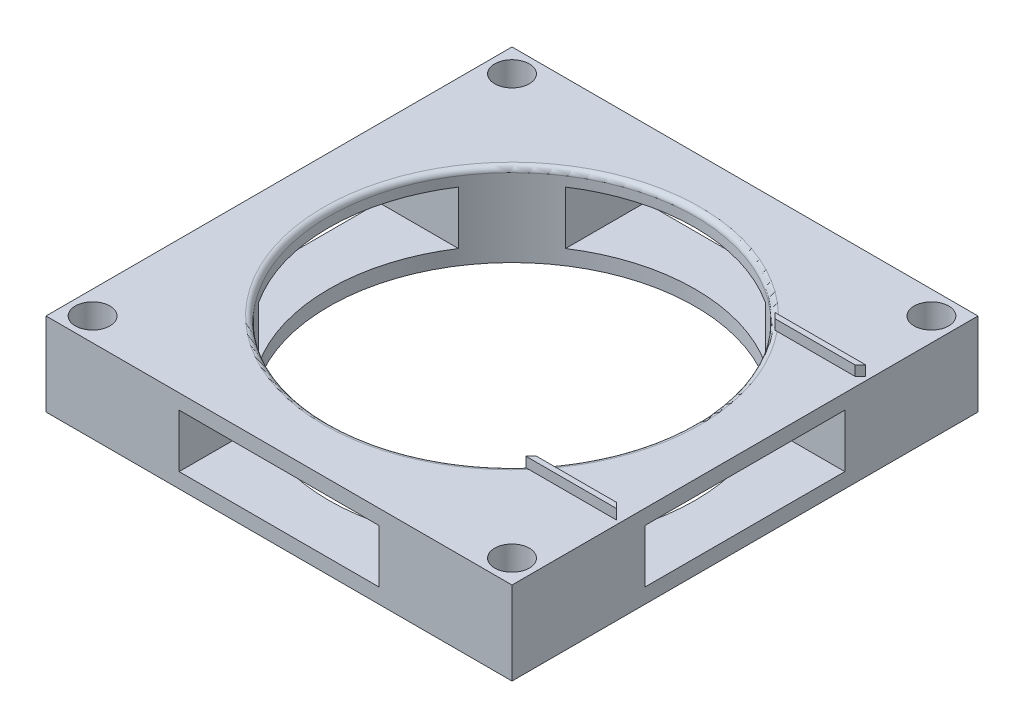
ISO-10303-21;
HEADER;
FILE_DESCRIPTION(('STEP AP214'),'2;1');
FILE_NAME('part.step','',(''),(''),'','','');
FILE_SCHEMA(('AUTOMOTIVE_DESIGN { 1 0 10303 214 1 1 1 1 }'));
ENDSEC;
DATA;
#1=APPLICATION_CONTEXT('core data for automotive mechanical design processes');
#2=APPLICATION_PROTOCOL_DEFINITION('international standard','automotive_design',2000,#1);
#3=PRODUCT_CONTEXT('',#1,'mechanical');
#4=PRODUCT('Part','Part','',(#3));
#5=PRODUCT_RELATED_PRODUCT_CATEGORY('part','',(#4));
#6=PRODUCT_DEFINITION_FORMATION('','',#4);
#7=PRODUCT_DEFINITION_CONTEXT('part definition',#1,'design');
#8=PRODUCT_DEFINITION('design','',#6,#7);
#9=PRODUCT_DEFINITION_SHAPE('','',#8);
#10=(LENGTH_UNIT() NAMED_UNIT(*) SI_UNIT(.MILLI.,.METRE.));
#11=(NAMED_UNIT(*) PLANE_ANGLE_UNIT() SI_UNIT($,.RADIAN.));
#12=(NAMED_UNIT(*) SI_UNIT($,.STERADIAN.) SOLID_ANGLE_UNIT());
#13=UNCERTAINTY_MEASURE_WITH_UNIT(LENGTH_MEASURE(1.E-05),#10,'distance_accuracy_value','');
#14=(GEOMETRIC_REPRESENTATION_CONTEXT(3) GLOBAL_UNCERTAINTY_ASSIGNED_CONTEXT((#13)) GLOBAL_UNIT_ASSIGNED_CONTEXT((#10,
#11,#12)) REPRESENTATION_CONTEXT('',''));
#15=CARTESIAN_POINT('',(0.,0.,0.));
#16=DIRECTION('',(0.,0.,1.));
#17=DIRECTION('',(1.,0.,0.));
#18=AXIS2_PLACEMENT_3D('',#15,#16,#17);
#19=CARTESIAN_POINT('',(0.,12.5,0.));
#20=DIRECTION('',(0.,1.,0.));
#21=DIRECTION('',(0.,0.,1.));
#22=AXIS2_PLACEMENT_3D('',#19,#20,#21);
#23=PLANE('',#22);
#24=CARTESIAN_POINT('',(31.5,12.5,-31.5));
#25=DIRECTION('',(0.,1.,0.));
#26=DIRECTION('',(0.,0.,1.));
#27=AXIS2_PLACEMENT_3D('',#24,#25,#26);
#28=CIRCLE('',#27,2.6);
#29=CARTESIAN_POINT('',(31.5,12.5,-28.9));
#30=VERTEX_POINT('',#29);
#31=EDGE_CURVE('E448',#30,#30,#28,.F.);
#32=ORIENTED_EDGE('',*,*,#31,.T.);
#33=EDGE_LOOP('',(#32));
#34=FACE_BOUND('',#33,.T.);
#35=CARTESIAN_POINT('',(-31.5,12.5,-31.5));
#36=DIRECTION('',(0.,1.,0.));
#37=DIRECTION('',(0.,0.,1.));
#38=AXIS2_PLACEMENT_3D('',#35,#36,#37);
#39=CIRCLE('',#38,2.6);
#40=CARTESIAN_POINT('',(-31.5,12.5,-28.9));
#41=VERTEX_POINT('',#40);
#42=EDGE_CURVE('E452',#41,#41,#39,.T.);
#43=ORIENTED_EDGE('',*,*,#42,.F.);
#44=EDGE_LOOP('',(#43));
#45=FACE_BOUND('',#44,.T.);
#46=DIRECTION('',(-1.,0.,0.));
#47=VECTOR('',#46,1.);
#48=CARTESIAN_POINT('',(0.,12.5,-35.));
#49=LINE('',#48,#47);
#50=CARTESIAN_POINT('',(35.,12.5,-35.));
#51=VERTEX_POINT('',#50);
#52=CARTESIAN_POINT('',(-35.,12.5,-35.));
#53=VERTEX_POINT('',#52);
#54=EDGE_CURVE('E457',#51,#53,#49,.T.);
#55=ORIENTED_EDGE('',*,*,#54,.T.);
#56=DIRECTION('',(0.,0.,1.));
#57=VECTOR('',#56,1.);
#58=CARTESIAN_POINT('',(-35.,12.5,0.));
#59=LINE('',#58,#57);
#60=CARTESIAN_POINT('',(-35.,12.5,35.));
#61=VERTEX_POINT('',#60);
#62=EDGE_CURVE('E461',#53,#61,#59,.T.);
#63=ORIENTED_EDGE('',*,*,#62,.T.);
#64=DIRECTION('',(-1.,0.,0.));
#65=VECTOR('',#64,1.);
#66=CARTESIAN_POINT('',(0.,12.5,35.));
#67=LINE('',#66,#65);
#68=CARTESIAN_POINT('',(35.,12.5,35.));
#69=VERTEX_POINT('',#68);
#70=EDGE_CURVE('E464',#69,#61,#67,.T.);
#71=ORIENTED_EDGE('',*,*,#70,.F.);
#72=DIRECTION('',(0.,0.,1.));
#73=VECTOR('',#72,1.);
#74=CARTESIAN_POINT('',(35.,12.5,0.));
#75=LINE('',#74,#73);
#76=EDGE_CURVE('E468',#51,#69,#75,.T.);
#77=ORIENTED_EDGE('',*,*,#76,.F.);
#78=EDGE_LOOP('',(#55,#63,#71,#77));
#79=FACE_BOUND('',#78,.T.);
#80=CARTESIAN_POINT('',(31.5,12.5,31.5));
#81=DIRECTION('',(0.,1.,0.));
#82=DIRECTION('',(0.,0.,1.));
#83=AXIS2_PLACEMENT_3D('',#80,#81,#82);
#84=CIRCLE('',#83,2.6);
#85=CARTESIAN_POINT('',(31.5,12.5,34.1));
#86=VERTEX_POINT('',#85);
#87=EDGE_CURVE('E472',#86,#86,#84,.T.);
#88=ORIENTED_EDGE('',*,*,#87,.F.);
#89=EDGE_LOOP('',(#88));
#90=FACE_BOUND('',#89,.T.);
#91=CARTESIAN_POINT('',(-31.5,12.5,31.5));
#92=DIRECTION('',(0.,1.,0.));
#93=DIRECTION('',(0.,0.,1.));
#94=AXIS2_PLACEMENT_3D('',#91,#92,#93);
#95=CIRCLE('',#94,2.6);
#96=CARTESIAN_POINT('',(-31.5,12.5,34.1));
#97=VERTEX_POINT('',#96);
#98=EDGE_CURVE('E476',#97,#97,#95,.F.);
#99=ORIENTED_EDGE('',*,*,#98,.T.);
#100=EDGE_LOOP('',(#99));
#101=FACE_BOUND('',#100,.T.);
#102=DIRECTION('',(-0.707106781186551,0.,-0.707106781186544));
#103=VECTOR('',#102,1.);
#104=CARTESIAN_POINT('',(33.6,12.5,17.9));
#105=LINE('',#104,#103);
#106=CARTESIAN_POINT('',(34.4,12.5,18.7));
#107=VERTEX_POINT('',#106);
#108=CARTESIAN_POINT('',(33.6,12.5,17.9));
#109=VERTEX_POINT('',#108);
#110=EDGE_CURVE('E374',#107,#109,#105,.T.);
#111=ORIENTED_EDGE('',*,*,#110,.F.);
#112=DIRECTION('',(1.,0.,0.));
#113=VECTOR('',#112,1.);
#114=CARTESIAN_POINT('',(34.4,12.5,18.7));
#115=LINE('',#114,#113);
#116=CARTESIAN_POINT('',(21.2414688757628,12.5,18.7));
#117=VERTEX_POINT('',#116);
#118=EDGE_CURVE('E379',#117,#107,#115,.T.);
#119=ORIENTED_EDGE('',*,*,#118,.F.);
#120=CARTESIAN_POINT('',(0.,12.5,0.));
#121=DIRECTION('',(0.,1.,0.));
#122=DIRECTION('',(0.,0.,1.));
#123=AXIS2_PLACEMENT_3D('',#120,#121,#122);
#124=CIRCLE('',#123,28.3);
#125=CARTESIAN_POINT('',(21.2414688757628,12.5,-18.7));
#126=VERTEX_POINT('',#125);
#127=EDGE_CURVE('E531',#117,#126,#124,.F.);
#128=ORIENTED_EDGE('',*,*,#127,.T.);
#129=DIRECTION('',(-1.,0.,0.));
#130=VECTOR('',#129,1.);
#131=CARTESIAN_POINT('',(34.4,12.5,-18.7));
#132=LINE('',#131,#130);
#133=CARTESIAN_POINT('',(34.4,12.5,-18.7));
#134=VERTEX_POINT('',#133);
#135=EDGE_CURVE('E406',#134,#126,#132,.T.);
#136=ORIENTED_EDGE('',*,*,#135,.F.);
#137=DIRECTION('',(0.707106781186549,0.,-0.707106781186546));
#138=VECTOR('',#137,1.);
#139=CARTESIAN_POINT('',(34.4,12.5,-18.7));
#140=LINE('',#139,#138);
#141=CARTESIAN_POINT('',(33.6,12.5,-17.9));
#142=VERTEX_POINT('',#141);
#143=EDGE_CURVE('E424',#142,#134,#140,.T.);
#144=ORIENTED_EDGE('',*,*,#143,.F.);
#145=DIRECTION('',(1.,0.,0.));
#146=VECTOR('',#145,1.);
#147=CARTESIAN_POINT('',(33.6,12.5,-17.9));
#148=LINE('',#147,#146);
#149=CARTESIAN_POINT('',(21.9198540141124,12.5,-17.9));
#150=VERTEX_POINT('',#149);
#151=EDGE_CURVE('E419',#150,#142,#148,.T.);
#152=ORIENTED_EDGE('',*,*,#151,.F.);
#153=CARTESIAN_POINT('',(21.9198540141124,12.5,17.9));
#154=VERTEX_POINT('',#153);
#155=EDGE_CURVE('E537',#150,#154,#124,.F.);
#156=ORIENTED_EDGE('',*,*,#155,.T.);
#157=DIRECTION('',(-1.,0.,0.));
#158=VECTOR('',#157,1.);
#159=CARTESIAN_POINT('',(33.6,12.5,17.9));
#160=LINE('',#159,#158);
#161=EDGE_CURVE('E370',#109,#154,#160,.T.);
#162=ORIENTED_EDGE('',*,*,#161,.F.);
#163=EDGE_LOOP('',(#111,#119,#128,#136,#144,#152,#156,#162));
#164=FACE_BOUND('',#163,.T.);
#165=ADVANCED_FACE('F47',(#34,#45,#79,#90,#101,#164),#23,.T.);
#166=CARTESIAN_POINT('',(0.,12.5,-35.));
#167=DIRECTION('',(0.,0.,1.));
#168=DIRECTION('',(1.,0.,0.));
#169=AXIS2_PLACEMENT_3D('',#166,#167,#168);
#170=PLANE('',#169);
#171=DIRECTION('',(-1.,0.,0.));
#172=VECTOR('',#171,1.);
#173=CARTESIAN_POINT('',(15.,10.25,-35.));
#174=LINE('',#173,#172);
#175=CARTESIAN_POINT('',(15.,10.25,-35.));
#176=VERTEX_POINT('',#175);
#177=CARTESIAN_POINT('',(-15.,10.25,-35.));
#178=VERTEX_POINT('',#177);
#179=EDGE_CURVE('E317',#176,#178,#174,.T.);
#180=ORIENTED_EDGE('',*,*,#179,.T.);
#181=DIRECTION('',(0.,-1.,0.));
#182=VECTOR('',#181,1.);
#183=CARTESIAN_POINT('',(-15.,2.25,-35.));
#184=LINE('',#183,#182);
#185=CARTESIAN_POINT('',(-15.,2.25,-35.));
#186=VERTEX_POINT('',#185);
#187=EDGE_CURVE('E304',#178,#186,#184,.T.);
#188=ORIENTED_EDGE('',*,*,#187,.T.);
#189=DIRECTION('',(1.,0.,0.));
#190=VECTOR('',#189,1.);
#191=CARTESIAN_POINT('',(15.,2.25,-35.));
#192=LINE('',#191,#190);
#193=CARTESIAN_POINT('',(15.,2.25,-35.));
#194=VERTEX_POINT('',#193);
#195=EDGE_CURVE('E308',#186,#194,#192,.T.);
#196=ORIENTED_EDGE('',*,*,#195,.T.);
#197=DIRECTION('',(0.,1.,0.));
#198=VECTOR('',#197,1.);
#199=CARTESIAN_POINT('',(15.,2.25,-35.));
#200=LINE('',#199,#198);
#201=EDGE_CURVE('E313',#194,#176,#200,.T.);
#202=ORIENTED_EDGE('',*,*,#201,.T.);
#203=EDGE_LOOP('',(#180,#188,#196,#202));
#204=FACE_BOUND('',#203,.T.);
#205=DIRECTION('',(-1.,0.,0.));
#206=VECTOR('',#205,1.);
#207=CARTESIAN_POINT('',(0.,0.,-35.));
#208=LINE('',#207,#206);
#209=CARTESIAN_POINT('',(35.,0.,-35.));
#210=VERTEX_POINT('',#209);
#211=CARTESIAN_POINT('',(-35.,0.,-35.));
#212=VERTEX_POINT('',#211);
#213=EDGE_CURVE('E489',#210,#212,#208,.T.);
#214=ORIENTED_EDGE('',*,*,#213,.T.);
#215=DIRECTION('',(0.,-1.,0.));
#216=VECTOR('',#215,1.);
#217=CARTESIAN_POINT('',(-35.,12.5,-35.));
#218=LINE('',#217,#216);
#219=EDGE_CURVE('E520',#53,#212,#218,.T.);
#220=ORIENTED_EDGE('',*,*,#219,.F.);
#221=ORIENTED_EDGE('',*,*,#54,.F.);
#222=DIRECTION('',(0.,-1.,0.));
#223=VECTOR('',#222,1.);
#224=CARTESIAN_POINT('',(35.,12.5,-35.));
#225=LINE('',#224,#223);
#226=EDGE_CURVE('E480',#51,#210,#225,.T.);
#227=ORIENTED_EDGE('',*,*,#226,.T.);
#228=EDGE_LOOP('',(#214,#220,#221,#227));
#229=FACE_BOUND('',#228,.T.);
#230=ADVANCED_FACE('F605',(#204,#229),#170,.F.);
#231=CARTESIAN_POINT('',(-35.,12.5,0.));
#232=DIRECTION('',(1.,0.,0.));
#233=DIRECTION('',(0.,0.,-1.));
#234=AXIS2_PLACEMENT_3D('',#231,#232,#233);
#235=PLANE('',#234);
#236=DIRECTION('',(0.,0.,1.));
#237=VECTOR('',#236,1.);
#238=CARTESIAN_POINT('',(-35.,10.25,-15.));
#239=LINE('',#238,#237);
#240=CARTESIAN_POINT('',(-35.,10.25,-15.));
#241=VERTEX_POINT('',#240);
#242=CARTESIAN_POINT('',(-35.,10.25,15.));
#243=VERTEX_POINT('',#242);
#244=EDGE_CURVE('E270',#241,#243,#239,.T.);
#245=ORIENTED_EDGE('',*,*,#244,.T.);
#246=DIRECTION('',(0.,-1.,0.));
#247=VECTOR('',#246,1.);
#248=CARTESIAN_POINT('',(-35.,10.25,15.));
#249=LINE('',#248,#247);
#250=CARTESIAN_POINT('',(-35.,2.25,15.));
#251=VERTEX_POINT('',#250);
#252=EDGE_CURVE('E252',#243,#251,#249,.T.);
#253=ORIENTED_EDGE('',*,*,#252,.T.);
#254=DIRECTION('',(0.,0.,-1.));
#255=VECTOR('',#254,1.);
#256=CARTESIAN_POINT('',(-35.,2.25000000000001,-15.));
#257=LINE('',#256,#255);
#258=CARTESIAN_POINT('',(-35.,2.25000000000001,-15.));
#259=VERTEX_POINT('',#258);
#260=EDGE_CURVE('E261',#251,#259,#257,.T.);
#261=ORIENTED_EDGE('',*,*,#260,.T.);
#262=DIRECTION('',(0.,1.,0.));
#263=VECTOR('',#262,1.);
#264=CARTESIAN_POINT('',(-35.,10.25,-15.));
#265=LINE('',#264,#263);
#266=EDGE_CURVE('E63',#259,#241,#265,.T.);
#267=ORIENTED_EDGE('',*,*,#266,.T.);
#268=EDGE_LOOP('',(#245,#253,#261,#267));
#269=FACE_BOUND('',#268,.T.);
#270=DIRECTION('',(0.,0.,1.));
#271=VECTOR('',#270,1.);
#272=CARTESIAN_POINT('',(-35.,0.,0.));
#273=LINE('',#272,#271);
#274=CARTESIAN_POINT('',(-35.,0.,35.));
#275=VERTEX_POINT('',#274);
#276=EDGE_CURVE('E493',#212,#275,#273,.T.);
#277=ORIENTED_EDGE('',*,*,#276,.T.);
#278=DIRECTION('',(0.,-1.,0.));
#279=VECTOR('',#278,1.);
#280=CARTESIAN_POINT('',(-35.,12.5,35.));
#281=LINE('',#280,#279);
#282=EDGE_CURVE('E517',#61,#275,#281,.T.);
#283=ORIENTED_EDGE('',*,*,#282,.F.);
#284=ORIENTED_EDGE('',*,*,#62,.F.);
#285=ORIENTED_EDGE('',*,*,#219,.T.);
#286=EDGE_LOOP('',(#277,#283,#284,#285));
#287=FACE_BOUND('',#286,.T.);
#288=ADVANCED_FACE('F267',(#269,#287),#235,.F.);
#289=CARTESIAN_POINT('',(0.,12.5,35.));
#290=DIRECTION('',(0.,0.,1.));
#291=DIRECTION('',(1.,0.,0.));
#292=AXIS2_PLACEMENT_3D('',#289,#290,#291);
#293=PLANE('',#292);
#294=DIRECTION('',(0.,-1.,0.));
#295=VECTOR('',#294,1.);
#296=CARTESIAN_POINT('',(-15.,2.25,35.));
#297=LINE('',#296,#295);
#298=CARTESIAN_POINT('',(-15.,10.25,35.));
#299=VERTEX_POINT('',#298);
#300=CARTESIAN_POINT('',(-15.,2.25,35.));
#301=VERTEX_POINT('',#300);
#302=EDGE_CURVE('E295',#299,#301,#297,.T.);
#303=ORIENTED_EDGE('',*,*,#302,.F.);
#304=DIRECTION('',(-1.,0.,0.));
#305=VECTOR('',#304,1.);
#306=CARTESIAN_POINT('',(15.,10.25,35.));
#307=LINE('',#306,#305);
#308=CARTESIAN_POINT('',(15.,10.25,35.));
#309=VERTEX_POINT('',#308);
#310=EDGE_CURVE('E309',#309,#299,#307,.T.);
#311=ORIENTED_EDGE('',*,*,#310,.F.);
#312=DIRECTION('',(0.,1.,0.));
#313=VECTOR('',#312,1.);
#314=CARTESIAN_POINT('',(15.,2.25,35.));
#315=LINE('',#314,#313);
#316=CARTESIAN_POINT('',(15.,2.25,35.));
#317=VERTEX_POINT('',#316);
#318=EDGE_CURVE('E328',#317,#309,#315,.T.);
#319=ORIENTED_EDGE('',*,*,#318,.F.);
#320=DIRECTION('',(1.,0.,0.));
#321=VECTOR('',#320,1.);
#322=CARTESIAN_POINT('',(15.,2.25,35.));
#323=LINE('',#322,#321);
#324=EDGE_CURVE('E324',#301,#317,#323,.T.);
#325=ORIENTED_EDGE('',*,*,#324,.F.);
#326=EDGE_LOOP('',(#303,#311,#319,#325));
#327=FACE_BOUND('',#326,.T.);
#328=DIRECTION('',(-1.,0.,0.));
#329=VECTOR('',#328,1.);
#330=CARTESIAN_POINT('',(0.,0.,35.));
#331=LINE('',#330,#329);
#332=CARTESIAN_POINT('',(35.,0.,35.));
#333=VERTEX_POINT('',#332);
#334=EDGE_CURVE('E497',#333,#275,#331,.T.);
#335=ORIENTED_EDGE('',*,*,#334,.F.);
#336=DIRECTION('',(0.,-1.,0.));
#337=VECTOR('',#336,1.);
#338=CARTESIAN_POINT('',(35.,12.5,35.));
#339=LINE('',#338,#337);
#340=EDGE_CURVE('E514',#69,#333,#339,.T.);
#341=ORIENTED_EDGE('',*,*,#340,.F.);
#342=ORIENTED_EDGE('',*,*,#70,.T.);
#343=ORIENTED_EDGE('',*,*,#282,.T.);
#344=EDGE_LOOP('',(#335,#341,#342,#343));
#345=FACE_BOUND('',#344,.T.);
#346=ADVANCED_FACE('F631',(#327,#345),#293,.T.);
#347=CARTESIAN_POINT('',(31.5,12.5,31.5));
#348=DIRECTION('',(0.,-1.,0.));
#349=DIRECTION('',(0.,0.,-1.));
#350=AXIS2_PLACEMENT_3D('',#347,#348,#349);
#351=CYLINDRICAL_SURFACE('',#350,2.6);
#352=ORIENTED_EDGE('',*,*,#87,.T.);
#353=EDGE_LOOP('',(#352));
#354=FACE_BOUND('',#353,.T.);
#355=CARTESIAN_POINT('',(31.5,0.,31.5));
#356=DIRECTION('',(0.,1.,0.));
#357=DIRECTION('',(0.,0.,1.));
#358=AXIS2_PLACEMENT_3D('',#355,#356,#357);
#359=CIRCLE('',#358,2.6);
#360=CARTESIAN_POINT('',(31.5,0.,34.1));
#361=VERTEX_POINT('',#360);
#362=EDGE_CURVE('E505',#361,#361,#359,.T.);
#363=ORIENTED_EDGE('',*,*,#362,.F.);
#364=EDGE_LOOP('',(#363));
#365=FACE_BOUND('',#364,.T.);
#366=ADVANCED_FACE('F627',(#354,#365),#351,.F.);
#367=CARTESIAN_POINT('',(35.,12.5,0.));
#368=DIRECTION('',(1.,0.,0.));
#369=DIRECTION('',(0.,0.,-1.));
#370=AXIS2_PLACEMENT_3D('',#367,#368,#369);
#371=PLANE('',#370);
#372=DIRECTION('',(0.,-1.,0.));
#373=VECTOR('',#372,1.);
#374=CARTESIAN_POINT('',(35.,10.25,15.));
#375=LINE('',#374,#373);
#376=CARTESIAN_POINT('',(35.,10.25,15.));
#377=VERTEX_POINT('',#376);
#378=CARTESIAN_POINT('',(35.,2.25,15.));
#379=VERTEX_POINT('',#378);
#380=EDGE_CURVE('E71',#377,#379,#375,.T.);
#381=ORIENTED_EDGE('',*,*,#380,.F.);
#382=DIRECTION('',(0.,0.,1.));
#383=VECTOR('',#382,1.);
#384=CARTESIAN_POINT('',(35.,10.25,-15.));
#385=LINE('',#384,#383);
#386=CARTESIAN_POINT('',(35.,10.25,-15.));
#387=VERTEX_POINT('',#386);
#388=EDGE_CURVE('E272',#387,#377,#385,.T.);
#389=ORIENTED_EDGE('',*,*,#388,.F.);
#390=DIRECTION('',(0.,1.,0.));
#391=VECTOR('',#390,1.);
#392=CARTESIAN_POINT('',(35.,10.25,-15.));
#393=LINE('',#392,#391);
#394=CARTESIAN_POINT('',(35.,2.25000000000001,-15.));
#395=VERTEX_POINT('',#394);
#396=EDGE_CURVE('E276',#395,#387,#393,.T.);
#397=ORIENTED_EDGE('',*,*,#396,.F.);
#398=DIRECTION('',(0.,0.,-1.));
#399=VECTOR('',#398,1.);
#400=CARTESIAN_POINT('',(35.,2.25000000000001,-15.));
#401=LINE('',#400,#399);
#402=EDGE_CURVE('E285',#379,#395,#401,.T.);
#403=ORIENTED_EDGE('',*,*,#402,.F.);
#404=EDGE_LOOP('',(#381,#389,#397,#403));
#405=FACE_BOUND('',#404,.T.);
#406=DIRECTION('',(0.,0.,1.));
#407=VECTOR('',#406,1.);
#408=CARTESIAN_POINT('',(35.,0.,0.));
#409=LINE('',#408,#407);
#410=EDGE_CURVE('E501',#210,#333,#409,.T.);
#411=ORIENTED_EDGE('',*,*,#410,.F.);
#412=ORIENTED_EDGE('',*,*,#226,.F.);
#413=ORIENTED_EDGE('',*,*,#76,.T.);
#414=ORIENTED_EDGE('',*,*,#340,.T.);
#415=EDGE_LOOP('',(#411,#412,#413,#414));
#416=FACE_BOUND('',#415,.T.);
#417=ADVANCED_FACE('F630',(#405,#416),#371,.T.);
#418=CARTESIAN_POINT('',(-31.5,12.5,-31.5));
#419=DIRECTION('',(0.,-1.,0.));
#420=DIRECTION('',(0.,0.,-1.));
#421=AXIS2_PLACEMENT_3D('',#418,#419,#420);
#422=CYLINDRICAL_SURFACE('',#421,2.6);
#423=ORIENTED_EDGE('',*,*,#42,.T.);
#424=EDGE_LOOP('',(#423));
#425=FACE_BOUND('',#424,.T.);
#426=CARTESIAN_POINT('',(-31.5,0.,-31.5));
#427=DIRECTION('',(0.,1.,0.));
#428=DIRECTION('',(0.,0.,1.));
#429=AXIS2_PLACEMENT_3D('',#426,#427,#428);
#430=CIRCLE('',#429,2.6);
#431=CARTESIAN_POINT('',(-31.5,0.,-28.9));
#432=VERTEX_POINT('',#431);
#433=EDGE_CURVE('E485',#432,#432,#430,.T.);
#434=ORIENTED_EDGE('',*,*,#433,.F.);
#435=EDGE_LOOP('',(#434));
#436=FACE_BOUND('',#435,.T.);
#437=ADVANCED_FACE('F635',(#425,#436),#422,.F.);
#438=CARTESIAN_POINT('',(31.5,12.5,-31.5));
#439=DIRECTION('',(0.,-1.,0.));
#440=DIRECTION('',(0.,0.,-1.));
#441=AXIS2_PLACEMENT_3D('',#438,#439,#440);
#442=CYLINDRICAL_SURFACE('',#441,2.6);
#443=ORIENTED_EDGE('',*,*,#31,.F.);
#444=EDGE_LOOP('',(#443));
#445=FACE_BOUND('',#444,.T.);
#446=CARTESIAN_POINT('',(31.5,0.,-31.5));
#447=DIRECTION('',(0.,1.,0.));
#448=DIRECTION('',(0.,0.,1.));
#449=AXIS2_PLACEMENT_3D('',#446,#447,#448);
#450=CIRCLE('',#449,2.6);
#451=CARTESIAN_POINT('',(31.5,0.,-28.9));
#452=VERTEX_POINT('',#451);
#453=EDGE_CURVE('E481',#452,#452,#450,.F.);
#454=ORIENTED_EDGE('',*,*,#453,.T.);
#455=EDGE_LOOP('',(#454));
#456=FACE_BOUND('',#455,.T.);
#457=ADVANCED_FACE('F625',(#445,#456),#442,.F.);
#458=CARTESIAN_POINT('',(-31.5,12.5,31.5));
#459=DIRECTION('',(0.,-1.,0.));
#460=DIRECTION('',(0.,0.,-1.));
#461=AXIS2_PLACEMENT_3D('',#458,#459,#460);
#462=CYLINDRICAL_SURFACE('',#461,2.6);
#463=ORIENTED_EDGE('',*,*,#98,.F.);
#464=EDGE_LOOP('',(#463));
#465=FACE_BOUND('',#464,.T.);
#466=CARTESIAN_POINT('',(-31.5,0.,31.5));
#467=DIRECTION('',(0.,1.,0.));
#468=DIRECTION('',(0.,0.,1.));
#469=AXIS2_PLACEMENT_3D('',#466,#467,#468);
#470=CIRCLE('',#469,2.6);
#471=CARTESIAN_POINT('',(-31.5,0.,34.1));
#472=VERTEX_POINT('',#471);
#473=EDGE_CURVE('E453',#472,#472,#470,.F.);
#474=ORIENTED_EDGE('',*,*,#473,.T.);
#475=EDGE_LOOP('',(#474));
#476=FACE_BOUND('',#475,.T.);
#477=ADVANCED_FACE('F621',(#465,#476),#462,.F.);
#478=CARTESIAN_POINT('',(0.,0.,0.));
#479=DIRECTION('',(0.,1.,0.));
#480=DIRECTION('',(0.,0.,1.));
#481=AXIS2_PLACEMENT_3D('',#478,#479,#480);
#482=PLANE('',#481);
#483=CARTESIAN_POINT('',(0.,0.,0.));
#484=DIRECTION('',(0.,1.,0.));
#485=DIRECTION('',(0.,0.,1.));
#486=AXIS2_PLACEMENT_3D('',#483,#484,#485);
#487=CIRCLE('',#486,27.5);
#488=CARTESIAN_POINT('',(0.,0.,27.5));
#489=VERTEX_POINT('',#488);
#490=EDGE_CURVE('E447',#489,#489,#487,.T.);
#491=ORIENTED_EDGE('',*,*,#490,.T.);
#492=EDGE_LOOP('',(#491));
#493=FACE_BOUND('',#492,.T.);
#494=ORIENTED_EDGE('',*,*,#453,.F.);
#495=EDGE_LOOP('',(#494));
#496=FACE_BOUND('',#495,.T.);
#497=ORIENTED_EDGE('',*,*,#433,.T.);
#498=EDGE_LOOP('',(#497));
#499=FACE_BOUND('',#498,.T.);
#500=ORIENTED_EDGE('',*,*,#213,.F.);
#501=ORIENTED_EDGE('',*,*,#410,.T.);
#502=ORIENTED_EDGE('',*,*,#334,.T.);
#503=ORIENTED_EDGE('',*,*,#276,.F.);
#504=EDGE_LOOP('',(#500,#501,#502,#503));
#505=FACE_BOUND('',#504,.T.);
#506=ORIENTED_EDGE('',*,*,#362,.T.);
#507=EDGE_LOOP('',(#506));
#508=FACE_BOUND('',#507,.T.);
#509=ORIENTED_EDGE('',*,*,#473,.F.);
#510=EDGE_LOOP('',(#509));
#511=FACE_BOUND('',#510,.T.);
#512=ADVANCED_FACE('F619',(#493,#496,#499,#505,#508,#511),#482,.F.);
#513=CARTESIAN_POINT('',(0.,-1.5,0.));
#514=DIRECTION('',(0.,1.,0.));
#515=DIRECTION('',(0.,0.,1.));
#516=AXIS2_PLACEMENT_3D('',#513,#514,#515);
#517=CYLINDRICAL_SURFACE('',#516,27.5);
#518=CARTESIAN_POINT('',(0.,2.25000000000001,0.));
#519=DIRECTION('',(0.,-1.,0.));
#520=DIRECTION('',(0.,0.,-1.));
#521=AXIS2_PLACEMENT_3D('',#518,#519,#520);
#522=CIRCLE('',#521,27.5);
#523=CARTESIAN_POINT('',(-23.0488611432322,2.25000000000001,-15.));
#524=VERTEX_POINT('',#523);
#525=CARTESIAN_POINT('',(-23.0488611432322,2.25,15.));
#526=VERTEX_POINT('',#525);
#527=EDGE_CURVE('E568',#524,#526,#522,.F.);
#528=ORIENTED_EDGE('',*,*,#527,.T.);
#529=DIRECTION('',(0.,1.,0.));
#530=VECTOR('',#529,1.);
#531=CARTESIAN_POINT('',(-23.0488611432322,-1.5,15.));
#532=LINE('',#531,#530);
#533=CARTESIAN_POINT('',(-23.0488611432322,10.25,15.));
#534=VERTEX_POINT('',#533);
#535=EDGE_CURVE('E11',#526,#534,#532,.T.);
#536=ORIENTED_EDGE('',*,*,#535,.T.);
#537=CARTESIAN_POINT('',(0.,10.25,0.));
#538=DIRECTION('',(0.,1.,0.));
#539=DIRECTION('',(0.,0.,1.));
#540=AXIS2_PLACEMENT_3D('',#537,#538,#539);
#541=CIRCLE('',#540,27.5);
#542=CARTESIAN_POINT('',(-23.0488611432322,10.25,-15.));
#543=VERTEX_POINT('',#542);
#544=EDGE_CURVE('E56',#534,#543,#541,.F.);
#545=ORIENTED_EDGE('',*,*,#544,.T.);
#546=DIRECTION('',(0.,1.,0.));
#547=VECTOR('',#546,1.);
#548=CARTESIAN_POINT('',(-23.0488611432322,-1.5,-15.));
#549=LINE('',#548,#547);
#550=EDGE_CURVE('E579',#543,#524,#549,.F.);
#551=ORIENTED_EDGE('',*,*,#550,.T.);
#552=EDGE_LOOP('',(#528,#536,#545,#551));
#553=FACE_BOUND('',#552,.T.);
#554=CARTESIAN_POINT('',(23.0488611432322,10.25,-15.));
#555=VERTEX_POINT('',#554);
#556=CARTESIAN_POINT('',(23.0488611432322,10.25,15.));
#557=VERTEX_POINT('',#556);
#558=EDGE_CURVE('E572',#555,#557,#541,.F.);
#559=ORIENTED_EDGE('',*,*,#558,.T.);
#560=DIRECTION('',(0.,1.,0.));
#561=VECTOR('',#560,1.);
#562=CARTESIAN_POINT('',(23.0488611432322,-1.5,15.));
#563=LINE('',#562,#561);
#564=CARTESIAN_POINT('',(23.0488611432322,2.25,15.));
#565=VERTEX_POINT('',#564);
#566=EDGE_CURVE('E576',#557,#565,#563,.F.);
#567=ORIENTED_EDGE('',*,*,#566,.T.);
#568=CARTESIAN_POINT('',(23.0488611432322,2.25000000000001,-15.));
#569=VERTEX_POINT('',#568);
#570=EDGE_CURVE('E563',#565,#569,#522,.F.);
#571=ORIENTED_EDGE('',*,*,#570,.T.);
#572=DIRECTION('',(0.,1.,0.));
#573=VECTOR('',#572,1.);
#574=CARTESIAN_POINT('',(23.0488611432322,-1.5,-15.));
#575=LINE('',#574,#573);
#576=EDGE_CURVE('E567',#569,#555,#575,.T.);
#577=ORIENTED_EDGE('',*,*,#576,.T.);
#578=EDGE_LOOP('',(#559,#567,#571,#577));
#579=FACE_BOUND('',#578,.T.);
#580=CARTESIAN_POINT('',(0.,2.25,0.));
#581=DIRECTION('',(0.,-1.,0.));
#582=DIRECTION('',(1.,0.,0.));
#583=AXIS2_PLACEMENT_3D('',#580,#581,#582);
#584=CIRCLE('',#583,27.5);
#585=CARTESIAN_POINT('',(15.,2.25,-23.0488611432322));
#586=VERTEX_POINT('',#585);
#587=CARTESIAN_POINT('',(-15.,2.25,-23.0488611432322));
#588=VERTEX_POINT('',#587);
#589=EDGE_CURVE('E542',#586,#588,#584,.F.);
#590=ORIENTED_EDGE('',*,*,#589,.T.);
#591=DIRECTION('',(0.,1.,0.));
#592=VECTOR('',#591,1.);
#593=CARTESIAN_POINT('',(-15.,-1.5,-23.0488611432322));
#594=LINE('',#593,#592);
#595=CARTESIAN_POINT('',(-15.,10.25,-23.0488611432322));
#596=VERTEX_POINT('',#595);
#597=EDGE_CURVE('E559',#588,#596,#594,.T.);
#598=ORIENTED_EDGE('',*,*,#597,.T.);
#599=CARTESIAN_POINT('',(0.,10.25,0.));
#600=DIRECTION('',(0.,1.,0.));
#601=DIRECTION('',(-1.,0.,0.));
#602=AXIS2_PLACEMENT_3D('',#599,#600,#601);
#603=CIRCLE('',#602,27.5);
#604=CARTESIAN_POINT('',(15.,10.25,-23.0488611432322));
#605=VERTEX_POINT('',#604);
#606=EDGE_CURVE('E551',#596,#605,#603,.F.);
#607=ORIENTED_EDGE('',*,*,#606,.T.);
#608=DIRECTION('',(0.,1.,0.));
#609=VECTOR('',#608,1.);
#610=CARTESIAN_POINT('',(15.,-1.5,-23.0488611432322));
#611=LINE('',#610,#609);
#612=EDGE_CURVE('E555',#605,#586,#611,.F.);
#613=ORIENTED_EDGE('',*,*,#612,.T.);
#614=EDGE_LOOP('',(#590,#598,#607,#613));
#615=FACE_BOUND('',#614,.T.);
#616=CARTESIAN_POINT('',(15.,10.25,23.0488611432322));
#617=VERTEX_POINT('',#616);
#618=CARTESIAN_POINT('',(-15.,10.25,23.0488611432322));
#619=VERTEX_POINT('',#618);
#620=EDGE_CURVE('E546',#617,#619,#603,.F.);
#621=ORIENTED_EDGE('',*,*,#620,.T.);
#622=DIRECTION('',(0.,1.,0.));
#623=VECTOR('',#622,1.);
#624=CARTESIAN_POINT('',(-15.,-1.5,23.0488611432322));
#625=LINE('',#624,#623);
#626=CARTESIAN_POINT('',(-15.,2.25,23.0488611432322));
#627=VERTEX_POINT('',#626);
#628=EDGE_CURVE('E550',#619,#627,#625,.F.);
#629=ORIENTED_EDGE('',*,*,#628,.T.);
#630=CARTESIAN_POINT('',(15.,2.25,23.0488611432322));
#631=VERTEX_POINT('',#630);
#632=EDGE_CURVE('E536',#627,#631,#584,.F.);
#633=ORIENTED_EDGE('',*,*,#632,.T.);
#634=DIRECTION('',(0.,1.,0.));
#635=VECTOR('',#634,1.);
#636=CARTESIAN_POINT('',(15.,-1.5,23.0488611432322));
#637=LINE('',#636,#635);
#638=EDGE_CURVE('E541',#631,#617,#637,.T.);
#639=ORIENTED_EDGE('',*,*,#638,.T.);
#640=EDGE_LOOP('',(#621,#629,#633,#639));
#641=FACE_BOUND('',#640,.T.);
#642=CARTESIAN_POINT('',(0.,11.7,0.));
#643=DIRECTION('',(0.,1.,0.));
#644=DIRECTION('',(0.,0.,1.));
#645=AXIS2_PLACEMENT_3D('',#642,#643,#644);
#646=CIRCLE('',#645,27.5);
#647=CARTESIAN_POINT('',(0.,11.7,27.5));
#648=VERTEX_POINT('',#647);
#649=EDGE_CURVE('E524',#648,#648,#646,.T.);
#650=ORIENTED_EDGE('',*,*,#649,.T.);
#651=EDGE_LOOP('',(#650));
#652=FACE_BOUND('',#651,.T.);
#653=ORIENTED_EDGE('',*,*,#490,.F.);
#654=EDGE_LOOP('',(#653));
#655=FACE_BOUND('',#654,.T.);
#656=ADVANCED_FACE('F586',(#553,#579,#615,#641,#652,#655),#517,.F.);
#657=CARTESIAN_POINT('',(0.,11.7,0.));
#658=DIRECTION('',(0.,1.,0.));
#659=DIRECTION('',(0.,0.,1.));
#660=AXIS2_PLACEMENT_3D('',#657,#658,#659);
#661=TOROIDAL_SURFACE('',#660,28.3,0.8);
#662=EDGE_CURVE('E532',#126,#150,#124,.F.);
#663=ORIENTED_EDGE('',*,*,#662,.F.);
#664=ORIENTED_EDGE('',*,*,#127,.F.);
#665=EDGE_CURVE('E702',#154,#117,#124,.F.);
#666=ORIENTED_EDGE('',*,*,#665,.F.);
#667=ORIENTED_EDGE('',*,*,#155,.F.);
#668=EDGE_LOOP('',(#663,#664,#666,#667));
#669=FACE_BOUND('',#668,.T.);
#670=ORIENTED_EDGE('',*,*,#649,.F.);
#671=EDGE_LOOP('',(#670));
#672=FACE_BOUND('',#671,.T.);
#673=ADVANCED_FACE('F49',(#669,#672),#661,.T.);
#674=CARTESIAN_POINT('',(0.,12.5,0.));
#675=DIRECTION('',(0.,-1.,0.));
#676=DIRECTION('',(0.,0.,-1.));
#677=AXIS2_PLACEMENT_3D('',#674,#675,#676);
#678=PLANE('',#677);
#679=CARTESIAN_POINT('',(20.8,12.5,-18.7));
#680=VERTEX_POINT('',#679);
#681=EDGE_CURVE('E428',#126,#680,#132,.T.);
#682=ORIENTED_EDGE('',*,*,#681,.F.);
#683=ORIENTED_EDGE('',*,*,#662,.T.);
#684=CARTESIAN_POINT('',(21.6,12.5,-17.9));
#685=VERTEX_POINT('',#684);
#686=EDGE_CURVE('E420',#685,#150,#148,.T.);
#687=ORIENTED_EDGE('',*,*,#686,.F.);
#688=DIRECTION('',(0.707106781186547,0.,0.707106781186547));
#689=VECTOR('',#688,1.);
#690=CARTESIAN_POINT('',(20.8,12.5,-18.7));
#691=LINE('',#690,#689);
#692=EDGE_CURVE('E388',#680,#685,#691,.T.);
#693=ORIENTED_EDGE('',*,*,#692,.F.);
#694=EDGE_LOOP('',(#682,#683,#687,#693));
#695=FACE_BOUND('',#694,.T.);
#696=ADVANCED_FACE('F713',(#695),#678,.T.);
#697=CARTESIAN_POINT('',(20.8,14.,-18.7));
#698=DIRECTION('',(0.707106781186548,0.,-0.707106781186548));
#699=DIRECTION('',(-0.707106781186548,0.,-0.707106781186548));
#700=AXIS2_PLACEMENT_3D('',#697,#698,#699);
#701=PLANE('',#700);
#702=ORIENTED_EDGE('',*,*,#692,.T.);
#703=DIRECTION('',(0.,-1.,0.));
#704=VECTOR('',#703,1.);
#705=CARTESIAN_POINT('',(21.6,14.,-17.9));
#706=LINE('',#705,#704);
#707=CARTESIAN_POINT('',(21.6,14.,-17.9));
#708=VERTEX_POINT('',#707);
#709=EDGE_CURVE('E443',#708,#685,#706,.T.);
#710=ORIENTED_EDGE('',*,*,#709,.F.);
#711=DIRECTION('',(0.707106781186547,0.,0.707106781186547));
#712=VECTOR('',#711,1.);
#713=CARTESIAN_POINT('',(20.8,14.,-18.7));
#714=LINE('',#713,#712);
#715=CARTESIAN_POINT('',(20.8,14.,-18.7));
#716=VERTEX_POINT('',#715);
#717=EDGE_CURVE('E401',#716,#708,#714,.T.);
#718=ORIENTED_EDGE('',*,*,#717,.F.);
#719=DIRECTION('',(0.,-1.,0.));
#720=VECTOR('',#719,1.);
#721=CARTESIAN_POINT('',(20.8,14.,-18.7));
#722=LINE('',#721,#720);
#723=EDGE_CURVE('E415',#716,#680,#722,.T.);
#724=ORIENTED_EDGE('',*,*,#723,.T.);
#725=EDGE_LOOP('',(#702,#710,#718,#724));
#726=FACE_BOUND('',#725,.T.);
#727=ADVANCED_FACE('F793',(#726),#701,.F.);
#728=CARTESIAN_POINT('',(33.6,14.,-17.9));
#729=DIRECTION('',(0.,0.,-1.));
#730=DIRECTION('',(-1.,0.,0.));
#731=AXIS2_PLACEMENT_3D('',#728,#729,#730);
#732=PLANE('',#731);
#733=ORIENTED_EDGE('',*,*,#686,.T.);
#734=ORIENTED_EDGE('',*,*,#151,.T.);
#735=DIRECTION('',(0.,-1.,0.));
#736=VECTOR('',#735,1.);
#737=CARTESIAN_POINT('',(33.6,14.,-17.9));
#738=LINE('',#737,#736);
#739=CARTESIAN_POINT('',(33.6,14.,-17.9));
#740=VERTEX_POINT('',#739);
#741=EDGE_CURVE('E439',#740,#142,#738,.T.);
#742=ORIENTED_EDGE('',*,*,#741,.F.);
#743=DIRECTION('',(1.,0.,0.));
#744=VECTOR('',#743,1.);
#745=CARTESIAN_POINT('',(33.6,14.,-17.9));
#746=LINE('',#745,#744);
#747=EDGE_CURVE('E405',#708,#740,#746,.T.);
#748=ORIENTED_EDGE('',*,*,#747,.F.);
#749=ORIENTED_EDGE('',*,*,#709,.T.);
#750=EDGE_LOOP('',(#733,#734,#742,#748,#749));
#751=FACE_BOUND('',#750,.T.);
#752=ADVANCED_FACE('F726',(#751),#732,.F.);
#753=CARTESIAN_POINT('',(34.4,14.,-18.7));
#754=DIRECTION('',(-0.707106781186546,0.,-0.707106781186549));
#755=DIRECTION('',(-0.707106781186549,0.,0.707106781186546));
#756=AXIS2_PLACEMENT_3D('',#753,#754,#755);
#757=PLANE('',#756);
#758=ORIENTED_EDGE('',*,*,#143,.T.);
#759=DIRECTION('',(0.,-1.,0.));
#760=VECTOR('',#759,1.);
#761=CARTESIAN_POINT('',(34.4,14.,-18.7));
#762=LINE('',#761,#760);
#763=CARTESIAN_POINT('',(34.4,14.,-18.7));
#764=VERTEX_POINT('',#763);
#765=EDGE_CURVE('E435',#764,#134,#762,.T.);
#766=ORIENTED_EDGE('',*,*,#765,.F.);
#767=DIRECTION('',(0.707106781186549,0.,-0.707106781186546));
#768=VECTOR('',#767,1.);
#769=CARTESIAN_POINT('',(34.4,14.,-18.7));
#770=LINE('',#769,#768);
#771=EDGE_CURVE('E409',#740,#764,#770,.T.);
#772=ORIENTED_EDGE('',*,*,#771,.F.);
#773=ORIENTED_EDGE('',*,*,#741,.T.);
#774=EDGE_LOOP('',(#758,#766,#772,#773));
#775=FACE_BOUND('',#774,.T.);
#776=ADVANCED_FACE('F722',(#775),#757,.F.);
#777=CARTESIAN_POINT('',(34.4,14.,-18.7));
#778=DIRECTION('',(0.,0.,1.));
#779=DIRECTION('',(1.,0.,0.));
#780=AXIS2_PLACEMENT_3D('',#777,#778,#779);
#781=PLANE('',#780);
#782=ORIENTED_EDGE('',*,*,#135,.T.);
#783=ORIENTED_EDGE('',*,*,#681,.T.);
#784=ORIENTED_EDGE('',*,*,#723,.F.);
#785=DIRECTION('',(-1.,0.,0.));
#786=VECTOR('',#785,1.);
#787=CARTESIAN_POINT('',(34.4,14.,-18.7));
#788=LINE('',#787,#786);
#789=EDGE_CURVE('E412',#764,#716,#788,.T.);
#790=ORIENTED_EDGE('',*,*,#789,.F.);
#791=ORIENTED_EDGE('',*,*,#765,.T.);
#792=EDGE_LOOP('',(#782,#783,#784,#790,#791));
#793=FACE_BOUND('',#792,.T.);
#794=ADVANCED_FACE('F717',(#793),#781,.F.);
#795=CARTESIAN_POINT('',(0.,14.,0.));
#796=DIRECTION('',(0.,-1.,0.));
#797=DIRECTION('',(0.,0.,-1.));
#798=AXIS2_PLACEMENT_3D('',#795,#796,#797);
#799=PLANE('',#798);
#800=ORIENTED_EDGE('',*,*,#717,.T.);
#801=ORIENTED_EDGE('',*,*,#747,.T.);
#802=ORIENTED_EDGE('',*,*,#771,.T.);
#803=ORIENTED_EDGE('',*,*,#789,.T.);
#804=EDGE_LOOP('',(#800,#801,#802,#803));
#805=FACE_BOUND('',#804,.T.);
#806=ADVANCED_FACE('F785',(#805),#799,.F.);
#807=CARTESIAN_POINT('',(0.,12.5,0.));
#808=DIRECTION('',(0.,-1.,0.));
#809=DIRECTION('',(0.,0.,-1.));
#810=AXIS2_PLACEMENT_3D('',#807,#808,#809);
#811=PLANE('',#810);
#812=CARTESIAN_POINT('',(21.6,12.5,17.9));
#813=VERTEX_POINT('',#812);
#814=EDGE_CURVE('E375',#154,#813,#160,.T.);
#815=ORIENTED_EDGE('',*,*,#814,.F.);
#816=ORIENTED_EDGE('',*,*,#665,.T.);
#817=CARTESIAN_POINT('',(20.8,12.5,18.7));
#818=VERTEX_POINT('',#817);
#819=EDGE_CURVE('E380',#818,#117,#115,.T.);
#820=ORIENTED_EDGE('',*,*,#819,.F.);
#821=DIRECTION('',(-0.707106781186551,0.,0.707106781186544));
#822=VECTOR('',#821,1.);
#823=CARTESIAN_POINT('',(20.8,12.5,18.7));
#824=LINE('',#823,#822);
#825=EDGE_CURVE('E384',#813,#818,#824,.T.);
#826=ORIENTED_EDGE('',*,*,#825,.F.);
#827=EDGE_LOOP('',(#815,#816,#820,#826));
#828=FACE_BOUND('',#827,.T.);
#829=ADVANCED_FACE('F701',(#828),#811,.T.);
#830=CARTESIAN_POINT('',(20.8,14.,18.7));
#831=DIRECTION('',(0.707106781186544,0.,0.70710678118655));
#832=DIRECTION('',(0.707106781186551,0.,-0.707106781186545));
#833=AXIS2_PLACEMENT_3D('',#830,#831,#832);
#834=PLANE('',#833);
#835=ORIENTED_EDGE('',*,*,#825,.T.);
#836=DIRECTION('',(0.,-1.,0.));
#837=VECTOR('',#836,1.);
#838=CARTESIAN_POINT('',(20.8,14.,18.7));
#839=LINE('',#838,#837);
#840=CARTESIAN_POINT('',(20.8,14.,18.7));
#841=VERTEX_POINT('',#840);
#842=EDGE_CURVE('E339',#841,#818,#839,.T.);
#843=ORIENTED_EDGE('',*,*,#842,.F.);
#844=DIRECTION('',(-0.707106781186551,0.,0.707106781186544));
#845=VECTOR('',#844,1.);
#846=CARTESIAN_POINT('',(20.8,14.,18.7));
#847=LINE('',#846,#845);
#848=CARTESIAN_POINT('',(21.6,14.,17.9));
#849=VERTEX_POINT('',#848);
#850=EDGE_CURVE('E397',#849,#841,#847,.T.);
#851=ORIENTED_EDGE('',*,*,#850,.F.);
#852=DIRECTION('',(0.,-1.,0.));
#853=VECTOR('',#852,1.);
#854=CARTESIAN_POINT('',(21.6,14.,17.9));
#855=LINE('',#854,#853);
#856=EDGE_CURVE('E365',#849,#813,#855,.T.);
#857=ORIENTED_EDGE('',*,*,#856,.T.);
#858=EDGE_LOOP('',(#835,#843,#851,#857));
#859=FACE_BOUND('',#858,.T.);
#860=ADVANCED_FACE('F698',(#859),#834,.F.);
#861=CARTESIAN_POINT('',(34.4,14.,18.7));
#862=DIRECTION('',(0.,0.,-1.));
#863=DIRECTION('',(-1.,0.,0.));
#864=AXIS2_PLACEMENT_3D('',#861,#862,#863);
#865=PLANE('',#864);
#866=ORIENTED_EDGE('',*,*,#819,.T.);
#867=ORIENTED_EDGE('',*,*,#118,.T.);
#868=DIRECTION('',(0.,-1.,0.));
#869=VECTOR('',#868,1.);
#870=CARTESIAN_POINT('',(34.4,14.,18.7));
#871=LINE('',#870,#869);
#872=CARTESIAN_POINT('',(34.4,14.,18.7));
#873=VERTEX_POINT('',#872);
#874=EDGE_CURVE('E357',#873,#107,#871,.T.);
#875=ORIENTED_EDGE('',*,*,#874,.F.);
#876=DIRECTION('',(1.,0.,0.));
#877=VECTOR('',#876,1.);
#878=CARTESIAN_POINT('',(34.4,14.,18.7));
#879=LINE('',#878,#877);
#880=EDGE_CURVE('E394',#841,#873,#879,.T.);
#881=ORIENTED_EDGE('',*,*,#880,.F.);
#882=ORIENTED_EDGE('',*,*,#842,.T.);
#883=EDGE_LOOP('',(#866,#867,#875,#881,#882));
#884=FACE_BOUND('',#883,.T.);
#885=ADVANCED_FACE('F686',(#884),#865,.F.);
#886=CARTESIAN_POINT('',(33.6,14.,17.9));
#887=DIRECTION('',(-0.707106781186544,0.,0.70710678118655));
#888=DIRECTION('',(0.707106781186551,0.,0.707106781186545));
#889=AXIS2_PLACEMENT_3D('',#886,#887,#888);
#890=PLANE('',#889);
#891=ORIENTED_EDGE('',*,*,#110,.T.);
#892=DIRECTION('',(0.,-1.,0.));
#893=VECTOR('',#892,1.);
#894=CARTESIAN_POINT('',(33.6,14.,17.9));
#895=LINE('',#894,#893);
#896=CARTESIAN_POINT('',(33.6,14.,17.9));
#897=VERTEX_POINT('',#896);
#898=EDGE_CURVE('E361',#897,#109,#895,.T.);
#899=ORIENTED_EDGE('',*,*,#898,.F.);
#900=DIRECTION('',(-0.707106781186551,0.,-0.707106781186544));
#901=VECTOR('',#900,1.);
#902=CARTESIAN_POINT('',(33.6,14.,17.9));
#903=LINE('',#902,#901);
#904=EDGE_CURVE('E391',#873,#897,#903,.T.);
#905=ORIENTED_EDGE('',*,*,#904,.F.);
#906=ORIENTED_EDGE('',*,*,#874,.T.);
#907=EDGE_LOOP('',(#891,#899,#905,#906));
#908=FACE_BOUND('',#907,.T.);
#909=ADVANCED_FACE('F689',(#908),#890,.F.);
#910=CARTESIAN_POINT('',(33.6,14.,17.9));
#911=DIRECTION('',(0.,0.,1.));
#912=DIRECTION('',(1.,0.,0.));
#913=AXIS2_PLACEMENT_3D('',#910,#911,#912);
#914=PLANE('',#913);
#915=ORIENTED_EDGE('',*,*,#161,.T.);
#916=ORIENTED_EDGE('',*,*,#814,.T.);
#917=ORIENTED_EDGE('',*,*,#856,.F.);
#918=DIRECTION('',(-1.,0.,0.));
#919=VECTOR('',#918,1.);
#920=CARTESIAN_POINT('',(33.6,14.,17.9));
#921=LINE('',#920,#919);
#922=EDGE_CURVE('E369',#897,#849,#921,.T.);
#923=ORIENTED_EDGE('',*,*,#922,.F.);
#924=ORIENTED_EDGE('',*,*,#898,.T.);
#925=EDGE_LOOP('',(#915,#916,#917,#923,#924));
#926=FACE_BOUND('',#925,.T.);
#927=ADVANCED_FACE('F779',(#926),#914,.F.);
#928=CARTESIAN_POINT('',(0.,14.,0.));
#929=DIRECTION('',(0.,-1.,0.));
#930=DIRECTION('',(0.,0.,-1.));
#931=AXIS2_PLACEMENT_3D('',#928,#929,#930);
#932=PLANE('',#931);
#933=ORIENTED_EDGE('',*,*,#850,.T.);
#934=ORIENTED_EDGE('',*,*,#880,.T.);
#935=ORIENTED_EDGE('',*,*,#904,.T.);
#936=ORIENTED_EDGE('',*,*,#922,.T.);
#937=EDGE_LOOP('',(#933,#934,#935,#936));
#938=FACE_BOUND('',#937,.T.);
#939=ADVANCED_FACE('F692',(#938),#932,.F.);
#940=CARTESIAN_POINT('',(15.,2.25,-35.));
#941=DIRECTION('',(0.,-1.,0.));
#942=DIRECTION('',(1.,0.,0.));
#943=AXIS2_PLACEMENT_3D('',#940,#941,#942);
#944=PLANE('',#943);
#945=DIRECTION('',(0.,0.,1.));
#946=VECTOR('',#945,1.);
#947=CARTESIAN_POINT('',(-15.,2.25,-35.));
#948=LINE('',#947,#946);
#949=EDGE_CURVE('E321',#627,#301,#948,.T.);
#950=ORIENTED_EDGE('',*,*,#949,.T.);
#951=ORIENTED_EDGE('',*,*,#324,.T.);
#952=DIRECTION('',(0.,0.,1.));
#953=VECTOR('',#952,1.);
#954=CARTESIAN_POINT('',(15.,2.25,-35.));
#955=LINE('',#954,#953);
#956=EDGE_CURVE('E350',#631,#317,#955,.T.);
#957=ORIENTED_EDGE('',*,*,#956,.F.);
#958=ORIENTED_EDGE('',*,*,#632,.F.);
#959=EDGE_LOOP('',(#950,#951,#957,#958));
#960=FACE_BOUND('',#959,.T.);
#961=ADVANCED_FACE('F768',(#960),#944,.F.);
#962=CARTESIAN_POINT('',(15.,2.25,-35.));
#963=DIRECTION('',(1.,0.,0.));
#964=DIRECTION('',(0.,0.,-1.));
#965=AXIS2_PLACEMENT_3D('',#962,#963,#964);
#966=PLANE('',#965);
#967=ORIENTED_EDGE('',*,*,#956,.T.);
#968=ORIENTED_EDGE('',*,*,#318,.T.);
#969=DIRECTION('',(0.,0.,1.));
#970=VECTOR('',#969,1.);
#971=CARTESIAN_POINT('',(15.,10.25,-35.));
#972=LINE('',#971,#970);
#973=EDGE_CURVE('E345',#617,#309,#972,.T.);
#974=ORIENTED_EDGE('',*,*,#973,.F.);
#975=ORIENTED_EDGE('',*,*,#638,.F.);
#976=EDGE_LOOP('',(#967,#968,#974,#975));
#977=FACE_BOUND('',#976,.T.);
#978=ADVANCED_FACE('F764',(#977),#966,.F.);
#979=CARTESIAN_POINT('',(15.,10.25,-35.));
#980=DIRECTION('',(0.,1.,0.));
#981=DIRECTION('',(-1.,0.,0.));
#982=AXIS2_PLACEMENT_3D('',#979,#980,#981);
#983=PLANE('',#982);
#984=ORIENTED_EDGE('',*,*,#973,.T.);
#985=ORIENTED_EDGE('',*,*,#310,.T.);
#986=DIRECTION('',(0.,0.,1.));
#987=VECTOR('',#986,1.);
#988=CARTESIAN_POINT('',(-15.,10.25,-35.));
#989=LINE('',#988,#987);
#990=EDGE_CURVE('E340',#619,#299,#989,.T.);
#991=ORIENTED_EDGE('',*,*,#990,.F.);
#992=ORIENTED_EDGE('',*,*,#620,.F.);
#993=EDGE_LOOP('',(#984,#985,#991,#992));
#994=FACE_BOUND('',#993,.T.);
#995=ADVANCED_FACE('F759',(#994),#983,.F.);
#996=CARTESIAN_POINT('',(-15.,2.25,-35.));
#997=DIRECTION('',(-1.,0.,0.));
#998=DIRECTION('',(0.,0.,1.));
#999=AXIS2_PLACEMENT_3D('',#996,#997,#998);
#1000=PLANE('',#999);
#1001=ORIENTED_EDGE('',*,*,#990,.T.);
#1002=ORIENTED_EDGE('',*,*,#302,.T.);
#1003=ORIENTED_EDGE('',*,*,#949,.F.);
#1004=ORIENTED_EDGE('',*,*,#628,.F.);
#1005=EDGE_LOOP('',(#1001,#1002,#1003,#1004));
#1006=FACE_BOUND('',#1005,.T.);
#1007=ADVANCED_FACE('F769',(#1006),#1000,.F.);
#1008=EDGE_CURVE('E351',#186,#588,#948,.T.);
#1009=ORIENTED_EDGE('',*,*,#1008,.F.);
#1010=ORIENTED_EDGE('',*,*,#187,.F.);
#1011=EDGE_CURVE('E335',#178,#596,#989,.T.);
#1012=ORIENTED_EDGE('',*,*,#1011,.T.);
#1013=ORIENTED_EDGE('',*,*,#597,.F.);
#1014=EDGE_LOOP('',(#1009,#1010,#1012,#1013));
#1015=FACE_BOUND('',#1014,.T.);
#1016=ADVANCED_FACE('F757',(#1015),#1000,.F.);
#1017=ORIENTED_EDGE('',*,*,#1011,.F.);
#1018=ORIENTED_EDGE('',*,*,#179,.F.);
#1019=EDGE_CURVE('E341',#176,#605,#972,.T.);
#1020=ORIENTED_EDGE('',*,*,#1019,.T.);
#1021=ORIENTED_EDGE('',*,*,#606,.F.);
#1022=EDGE_LOOP('',(#1017,#1018,#1020,#1021));
#1023=FACE_BOUND('',#1022,.T.);
#1024=ADVANCED_FACE('F753',(#1023),#983,.F.);
#1025=ORIENTED_EDGE('',*,*,#1019,.F.);
#1026=ORIENTED_EDGE('',*,*,#201,.F.);
#1027=EDGE_CURVE('E346',#194,#586,#955,.T.);
#1028=ORIENTED_EDGE('',*,*,#1027,.T.);
#1029=ORIENTED_EDGE('',*,*,#612,.F.);
#1030=EDGE_LOOP('',(#1025,#1026,#1028,#1029));
#1031=FACE_BOUND('',#1030,.T.);
#1032=ADVANCED_FACE('F756',(#1031),#966,.F.);
#1033=ORIENTED_EDGE('',*,*,#1027,.F.);
#1034=ORIENTED_EDGE('',*,*,#195,.F.);
#1035=ORIENTED_EDGE('',*,*,#1008,.T.);
#1036=ORIENTED_EDGE('',*,*,#589,.F.);
#1037=EDGE_LOOP('',(#1033,#1034,#1035,#1036));
#1038=FACE_BOUND('',#1037,.T.);
#1039=ADVANCED_FACE('F762',(#1038),#944,.F.);
#1040=CARTESIAN_POINT('',(-35.,2.25000000000001,-15.));
#1041=DIRECTION('',(0.,-1.,0.));
#1042=DIRECTION('',(0.,0.,-1.));
#1043=AXIS2_PLACEMENT_3D('',#1040,#1041,#1042);
#1044=PLANE('',#1043);
#1045=DIRECTION('',(1.,0.,0.));
#1046=VECTOR('',#1045,1.);
#1047=CARTESIAN_POINT('',(-35.,2.25,15.));
#1048=LINE('',#1047,#1046);
#1049=EDGE_CURVE('E258',#565,#379,#1048,.T.);
#1050=ORIENTED_EDGE('',*,*,#1049,.T.);
#1051=ORIENTED_EDGE('',*,*,#402,.T.);
#1052=DIRECTION('',(1.,0.,0.));
#1053=VECTOR('',#1052,1.);
#1054=CARTESIAN_POINT('',(-35.,2.25000000000001,-15.));
#1055=LINE('',#1054,#1053);
#1056=EDGE_CURVE('E257',#569,#395,#1055,.T.);
#1057=ORIENTED_EDGE('',*,*,#1056,.F.);
#1058=ORIENTED_EDGE('',*,*,#570,.F.);
#1059=EDGE_LOOP('',(#1050,#1051,#1057,#1058));
#1060=FACE_BOUND('',#1059,.T.);
#1061=ADVANCED_FACE('F740',(#1060),#1044,.F.);
#1062=CARTESIAN_POINT('',(-35.,10.25,-15.));
#1063=DIRECTION('',(0.,0.,-1.));
#1064=DIRECTION('',(0.,1.,0.));
#1065=AXIS2_PLACEMENT_3D('',#1062,#1063,#1064);
#1066=PLANE('',#1065);
#1067=ORIENTED_EDGE('',*,*,#1056,.T.);
#1068=ORIENTED_EDGE('',*,*,#396,.T.);
#1069=DIRECTION('',(1.,0.,0.));
#1070=VECTOR('',#1069,1.);
#1071=CARTESIAN_POINT('',(-35.,10.25,-15.));
#1072=LINE('',#1071,#1070);
#1073=EDGE_CURVE('E301',#555,#387,#1072,.T.);
#1074=ORIENTED_EDGE('',*,*,#1073,.F.);
#1075=ORIENTED_EDGE('',*,*,#576,.F.);
#1076=EDGE_LOOP('',(#1067,#1068,#1074,#1075));
#1077=FACE_BOUND('',#1076,.T.);
#1078=ADVANCED_FACE('F599',(#1077),#1066,.F.);
#1079=CARTESIAN_POINT('',(-35.,10.25,-15.));
#1080=DIRECTION('',(0.,1.,0.));
#1081=DIRECTION('',(0.,0.,1.));
#1082=AXIS2_PLACEMENT_3D('',#1079,#1080,#1081);
#1083=PLANE('',#1082);
#1084=ORIENTED_EDGE('',*,*,#1073,.T.);
#1085=ORIENTED_EDGE('',*,*,#388,.T.);
#1086=DIRECTION('',(1.,0.,0.));
#1087=VECTOR('',#1086,1.);
#1088=CARTESIAN_POINT('',(-35.,10.25,15.));
#1089=LINE('',#1088,#1087);
#1090=EDGE_CURVE('E296',#557,#377,#1089,.T.);
#1091=ORIENTED_EDGE('',*,*,#1090,.F.);
#1092=ORIENTED_EDGE('',*,*,#558,.F.);
#1093=EDGE_LOOP('',(#1084,#1085,#1091,#1092));
#1094=FACE_BOUND('',#1093,.T.);
#1095=ADVANCED_FACE('F593',(#1094),#1083,.F.);
#1096=CARTESIAN_POINT('',(-35.,10.25,15.));
#1097=DIRECTION('',(0.,0.,1.));
#1098=DIRECTION('',(0.,-1.,0.));
#1099=AXIS2_PLACEMENT_3D('',#1096,#1097,#1098);
#1100=PLANE('',#1099);
#1101=ORIENTED_EDGE('',*,*,#1090,.T.);
#1102=ORIENTED_EDGE('',*,*,#380,.T.);
#1103=ORIENTED_EDGE('',*,*,#1049,.F.);
#1104=ORIENTED_EDGE('',*,*,#566,.F.);
#1105=EDGE_LOOP('',(#1101,#1102,#1103,#1104));
#1106=FACE_BOUND('',#1105,.T.);
#1107=ADVANCED_FACE('F600',(#1106),#1100,.F.);
#1108=EDGE_CURVE('E247',#251,#526,#1048,.T.);
#1109=ORIENTED_EDGE('',*,*,#1108,.F.);
#1110=ORIENTED_EDGE('',*,*,#252,.F.);
#1111=EDGE_CURVE('E292',#243,#534,#1089,.T.);
#1112=ORIENTED_EDGE('',*,*,#1111,.T.);
#1113=ORIENTED_EDGE('',*,*,#535,.F.);
#1114=EDGE_LOOP('',(#1109,#1110,#1112,#1113));
#1115=FACE_BOUND('',#1114,.T.);
#1116=ADVANCED_FACE('F249',(#1115),#1100,.F.);
#1117=ORIENTED_EDGE('',*,*,#1111,.F.);
#1118=ORIENTED_EDGE('',*,*,#244,.F.);
#1119=EDGE_CURVE('E297',#241,#543,#1072,.T.);
#1120=ORIENTED_EDGE('',*,*,#1119,.T.);
#1121=ORIENTED_EDGE('',*,*,#544,.F.);
#1122=EDGE_LOOP('',(#1117,#1118,#1120,#1121));
#1123=FACE_BOUND('',#1122,.T.);
#1124=ADVANCED_FACE('F590',(#1123),#1083,.F.);
#1125=ORIENTED_EDGE('',*,*,#1119,.F.);
#1126=ORIENTED_EDGE('',*,*,#266,.F.);
#1127=EDGE_CURVE('E263',#259,#524,#1055,.T.);
#1128=ORIENTED_EDGE('',*,*,#1127,.T.);
#1129=ORIENTED_EDGE('',*,*,#550,.F.);
#1130=EDGE_LOOP('',(#1125,#1126,#1128,#1129));
#1131=FACE_BOUND('',#1130,.T.);
#1132=ADVANCED_FACE('F588',(#1131),#1066,.F.);
#1133=ORIENTED_EDGE('',*,*,#1127,.F.);
#1134=ORIENTED_EDGE('',*,*,#260,.F.);
#1135=ORIENTED_EDGE('',*,*,#1108,.T.);
#1136=ORIENTED_EDGE('',*,*,#527,.F.);
#1137=EDGE_LOOP('',(#1133,#1134,#1135,#1136));
#1138=FACE_BOUND('',#1137,.T.);
#1139=ADVANCED_FACE('F262',(#1138),#1044,.F.);
#1140=CLOSED_SHELL('',(#165,#230,#288,#346,#366,#417,#437,#457,#477,#512,#656,#673,#696,#727,
#752,#776,#794,#806,#829,#860,#885,#909,#927,#939,#961,#978,#995,#1007,#1016,#1024,#1032,#1039,
#1061,#1078,#1095,#1107,#1116,#1124,#1132,#1139));
#1141=MANIFOLD_SOLID_BREP('B2',#1140);
#1142=ADVANCED_BREP_SHAPE_REPRESENTATION('',(#18,#1141),#14);
#1143=SHAPE_DEFINITION_REPRESENTATION(#9,#1142);
ENDSEC;
END-ISO-10303-21;
